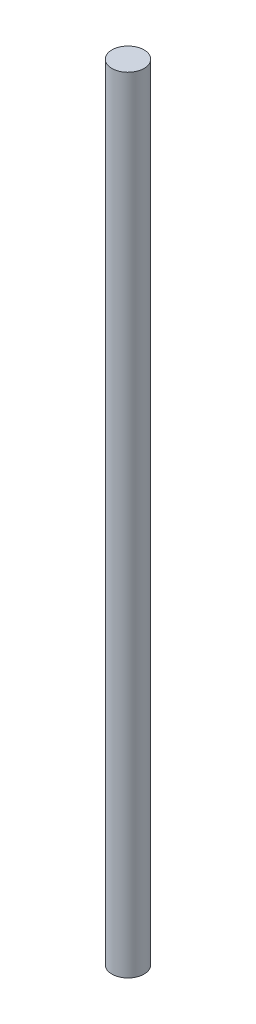
ISO-10303-21;
HEADER;
FILE_DESCRIPTION(('STEP AP214'),'2;1');
FILE_NAME('part.step','',(''),(''),'','','');
FILE_SCHEMA(('AUTOMOTIVE_DESIGN { 1 0 10303 214 1 1 1 1 }'));
ENDSEC;
DATA;
#1=APPLICATION_CONTEXT('core data for automotive mechanical design processes');
#2=APPLICATION_PROTOCOL_DEFINITION('international standard','automotive_design',2000,#1);
#3=PRODUCT_CONTEXT('',#1,'mechanical');
#4=PRODUCT('Part','Part','',(#3));
#5=PRODUCT_RELATED_PRODUCT_CATEGORY('part','',(#4));
#6=PRODUCT_DEFINITION_FORMATION('','',#4);
#7=PRODUCT_DEFINITION_CONTEXT('part definition',#1,'design');
#8=PRODUCT_DEFINITION('design','',#6,#7);
#9=PRODUCT_DEFINITION_SHAPE('','',#8);
#10=(LENGTH_UNIT() NAMED_UNIT(*) SI_UNIT(.MILLI.,.METRE.));
#11=(NAMED_UNIT(*) PLANE_ANGLE_UNIT() SI_UNIT($,.RADIAN.));
#12=(NAMED_UNIT(*) SI_UNIT($,.STERADIAN.) SOLID_ANGLE_UNIT());
#13=UNCERTAINTY_MEASURE_WITH_UNIT(LENGTH_MEASURE(1.E-05),#10,'distance_accuracy_value','');
#14=(GEOMETRIC_REPRESENTATION_CONTEXT(3) GLOBAL_UNCERTAINTY_ASSIGNED_CONTEXT((#13)) GLOBAL_UNIT_ASSIGNED_CONTEXT((#10,
#11,#12)) REPRESENTATION_CONTEXT('',''));
#15=CARTESIAN_POINT('',(0.,0.,0.));
#16=DIRECTION('',(0.,0.,1.));
#17=DIRECTION('',(1.,0.,0.));
#18=AXIS2_PLACEMENT_3D('',#15,#16,#17);
#19=CARTESIAN_POINT('',(0.,195.,0.));
#20=DIRECTION('',(0.,-1.,0.));
#21=DIRECTION('',(0.,0.,-1.));
#22=AXIS2_PLACEMENT_3D('',#19,#20,#21);
#23=CYLINDRICAL_SURFACE('',#22,4.);
#24=CARTESIAN_POINT('',(0.,195.,0.));
#25=DIRECTION('',(0.,1.,0.));
#26=DIRECTION('',(0.,0.,1.));
#27=AXIS2_PLACEMENT_3D('',#24,#25,#26);
#28=CIRCLE('',#27,4.);
#29=CARTESIAN_POINT('',(0.,195.,4.));
#30=VERTEX_POINT('',#29);
#31=EDGE_CURVE('E10',#30,#30,#28,.T.);
#32=ORIENTED_EDGE('',*,*,#31,.F.);
#33=EDGE_LOOP('',(#32));
#34=FACE_BOUND('',#33,.T.);
#35=CARTESIAN_POINT('',(0.,0.,0.));
#36=DIRECTION('',(0.,1.,0.));
#37=DIRECTION('',(0.,0.,1.));
#38=AXIS2_PLACEMENT_3D('',#35,#36,#37);
#39=CIRCLE('',#38,4.);
#40=CARTESIAN_POINT('',(0.,0.,4.));
#41=VERTEX_POINT('',#40);
#42=EDGE_CURVE('E35',#41,#41,#39,.T.);
#43=ORIENTED_EDGE('',*,*,#42,.T.);
#44=EDGE_LOOP('',(#43));
#45=FACE_BOUND('',#44,.T.);
#46=ADVANCED_FACE('F32',(#34,#45),#23,.T.);
#47=CARTESIAN_POINT('',(0.,195.,0.));
#48=DIRECTION('',(0.,1.,0.));
#49=DIRECTION('',(0.,0.,1.));
#50=AXIS2_PLACEMENT_3D('',#47,#48,#49);
#51=PLANE('',#50);
#52=ORIENTED_EDGE('',*,*,#31,.T.);
#53=EDGE_LOOP('',(#52));
#54=FACE_BOUND('',#53,.T.);
#55=ADVANCED_FACE('F47',(#54),#51,.T.);
#56=CARTESIAN_POINT('',(0.,0.,0.));
#57=DIRECTION('',(0.,1.,0.));
#58=DIRECTION('',(0.,0.,1.));
#59=AXIS2_PLACEMENT_3D('',#56,#57,#58);
#60=PLANE('',#59);
#61=ORIENTED_EDGE('',*,*,#42,.F.);
#62=EDGE_LOOP('',(#61));
#63=FACE_BOUND('',#62,.T.);
#64=ADVANCED_FACE('F45',(#63),#60,.F.);
#65=CLOSED_SHELL('',(#46,#55,#64));
#66=MANIFOLD_SOLID_BREP('B2',#65);
#67=ADVANCED_BREP_SHAPE_REPRESENTATION('',(#18,#66),#14);
#68=SHAPE_DEFINITION_REPRESENTATION(#9,#67);
ENDSEC;
END-ISO-10303-21;
